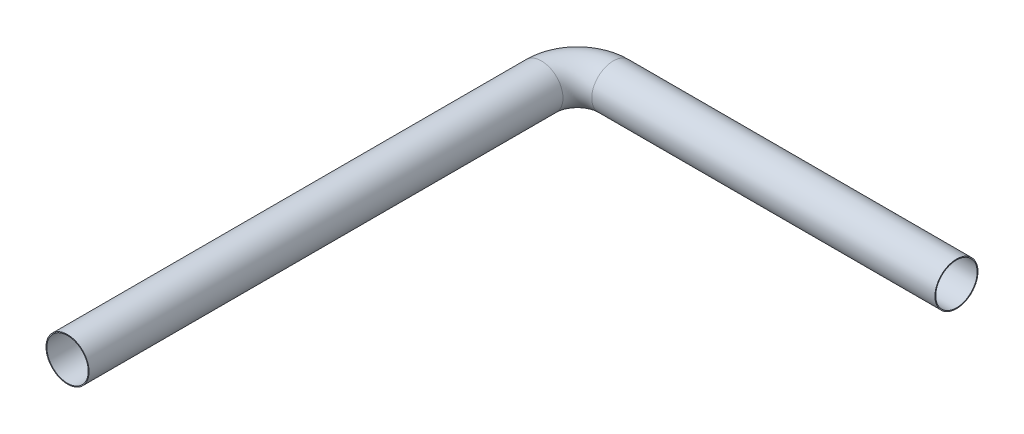
ISO-10303-21;
HEADER;
FILE_DESCRIPTION(('STEP AP214'),'2;1');
FILE_NAME('part.step','',(''),(''),'','','');
FILE_SCHEMA(('AUTOMOTIVE_DESIGN { 1 0 10303 214 1 1 1 1 }'));
ENDSEC;
DATA;
#1=APPLICATION_CONTEXT('core data for automotive mechanical design processes');
#2=APPLICATION_PROTOCOL_DEFINITION('international standard','automotive_design',2000,#1);
#3=PRODUCT_CONTEXT('',#1,'mechanical');
#4=PRODUCT('Part','Part','',(#3));
#5=PRODUCT_RELATED_PRODUCT_CATEGORY('part','',(#4));
#6=PRODUCT_DEFINITION_FORMATION('','',#4);
#7=PRODUCT_DEFINITION_CONTEXT('part definition',#1,'design');
#8=PRODUCT_DEFINITION('design','',#6,#7);
#9=PRODUCT_DEFINITION_SHAPE('','',#8);
#10=(LENGTH_UNIT() NAMED_UNIT(*) SI_UNIT(.MILLI.,.METRE.));
#11=(NAMED_UNIT(*) PLANE_ANGLE_UNIT() SI_UNIT($,.RADIAN.));
#12=(NAMED_UNIT(*) SI_UNIT($,.STERADIAN.) SOLID_ANGLE_UNIT());
#13=UNCERTAINTY_MEASURE_WITH_UNIT(LENGTH_MEASURE(1.E-05),#10,'distance_accuracy_value','');
#14=(GEOMETRIC_REPRESENTATION_CONTEXT(3) GLOBAL_UNCERTAINTY_ASSIGNED_CONTEXT((#13)) GLOBAL_UNIT_ASSIGNED_CONTEXT((#10,
#11,#12)) REPRESENTATION_CONTEXT('',''));
#15=CARTESIAN_POINT('',(0.,0.,0.));
#16=DIRECTION('',(0.,0.,1.));
#17=DIRECTION('',(1.,0.,0.));
#18=AXIS2_PLACEMENT_3D('',#15,#16,#17);
#19=CARTESIAN_POINT('',(0.,0.,0.));
#20=DIRECTION('',(0.,0.,-1.));
#21=DIRECTION('',(-1.,0.,0.));
#22=AXIS2_PLACEMENT_3D('',#19,#20,#21);
#23=CYLINDRICAL_SURFACE('',#22,30.);
#24=CARTESIAN_POINT('',(0.,0.,-660.));
#25=DIRECTION('',(0.,0.,1.));
#26=DIRECTION('',(1.,0.,0.));
#27=AXIS2_PLACEMENT_3D('',#24,#25,#26);
#28=CIRCLE('',#27,30.);
#29=CARTESIAN_POINT('',(-30.,0.,-660.));
#30=VERTEX_POINT('',#29);
#31=EDGE_CURVE('E99',#30,#30,#28,.T.);
#32=ORIENTED_EDGE('',*,*,#31,.T.);
#33=EDGE_LOOP('',(#32));
#34=FACE_BOUND('',#33,.T.);
#35=CARTESIAN_POINT('',(0.,0.,0.));
#36=DIRECTION('',(0.,0.,1.));
#37=DIRECTION('',(1.,0.,0.));
#38=AXIS2_PLACEMENT_3D('',#35,#36,#37);
#39=CIRCLE('',#38,30.);
#40=CARTESIAN_POINT('',(30.,0.,0.));
#41=VERTEX_POINT('',#40);
#42=EDGE_CURVE('E48',#41,#41,#39,.T.);
#43=ORIENTED_EDGE('',*,*,#42,.F.);
#44=EDGE_LOOP('',(#43));
#45=FACE_BOUND('',#44,.T.);
#46=ADVANCED_FACE('F33',(#34,#45),#23,.T.);
#47=CARTESIAN_POINT('',(50.,0.,-660.));
#48=DIRECTION('',(0.,-1.,0.));
#49=DIRECTION('',(0.,0.,-1.));
#50=AXIS2_PLACEMENT_3D('',#47,#48,#49);
#51=TOROIDAL_SURFACE('',#50,50.,30.);
#52=CARTESIAN_POINT('',(50.,0.,-710.));
#53=DIRECTION('',(-1.,0.,0.));
#54=DIRECTION('',(0.,0.,1.));
#55=AXIS2_PLACEMENT_3D('',#52,#53,#54);
#56=CIRCLE('',#55,30.);
#57=CARTESIAN_POINT('',(50.,0.,-740.));
#58=VERTEX_POINT('',#57);
#59=EDGE_CURVE('E37',#58,#58,#56,.T.);
#60=CARTESIAN_POINT('',(50.,0.,-660.));
#61=DIRECTION('',(0.,-1.,0.));
#62=DIRECTION('',(0.,0.,-1.));
#63=AXIS2_PLACEMENT_3D('',#60,#61,#62);
#64=CIRCLE('',#63,80.);
#65=EDGE_CURVE('',#30,#58,#64,.T.);
#66=ORIENTED_EDGE('',*,*,#31,.F.);
#67=ORIENTED_EDGE('',*,*,#59,.T.);
#68=ORIENTED_EDGE('',*,*,#65,.T.);
#69=ORIENTED_EDGE('',*,*,#65,.F.);
#70=EDGE_LOOP('',(#66,#68,#67,#69));
#71=FACE_BOUND('',#70,.T.);
#72=ADVANCED_FACE('F106',(#71),#51,.T.);
#73=CARTESIAN_POINT('',(50.,0.,-710.));
#74=DIRECTION('',(1.,0.,0.));
#75=DIRECTION('',(0.,0.,-1.));
#76=AXIS2_PLACEMENT_3D('',#73,#74,#75);
#77=CYLINDRICAL_SURFACE('',#76,30.);
#78=CARTESIAN_POINT('',(527.958415109164,0.,-710.));
#79=DIRECTION('',(-1.,0.,0.));
#80=DIRECTION('',(0.,0.,1.));
#81=AXIS2_PLACEMENT_3D('',#78,#79,#80);
#82=CIRCLE('',#81,30.);
#83=CARTESIAN_POINT('',(527.958415109164,0.,-680.));
#84=VERTEX_POINT('',#83);
#85=EDGE_CURVE('E53',#84,#84,#82,.T.);
#86=ORIENTED_EDGE('',*,*,#85,.T.);
#87=EDGE_LOOP('',(#86));
#88=FACE_BOUND('',#87,.T.);
#89=ORIENTED_EDGE('',*,*,#59,.F.);
#90=EDGE_LOOP('',(#89));
#91=FACE_BOUND('',#90,.T.);
#92=ADVANCED_FACE('F35',(#88,#91),#77,.T.);
#93=CARTESIAN_POINT('',(0.,0.,0.));
#94=DIRECTION('',(0.,0.,1.));
#95=DIRECTION('',(1.,0.,0.));
#96=AXIS2_PLACEMENT_3D('',#93,#94,#95);
#97=PLANE('',#96);
#98=CARTESIAN_POINT('',(0.,0.,0.));
#99=DIRECTION('',(0.,0.,1.));
#100=DIRECTION('',(1.,0.,0.));
#101=AXIS2_PLACEMENT_3D('',#98,#99,#100);
#102=CIRCLE('',#101,28.8);
#103=CARTESIAN_POINT('',(28.8,0.,0.));
#104=VERTEX_POINT('',#103);
#105=EDGE_CURVE('E92',#104,#104,#102,.F.);
#106=ORIENTED_EDGE('',*,*,#105,.T.);
#107=EDGE_LOOP('',(#106));
#108=FACE_BOUND('',#107,.T.);
#109=ORIENTED_EDGE('',*,*,#42,.T.);
#110=EDGE_LOOP('',(#109));
#111=FACE_BOUND('',#110,.T.);
#112=ADVANCED_FACE('F66',(#108,#111),#97,.T.);
#113=CARTESIAN_POINT('',(527.958415109164,0.,-710.));
#114=DIRECTION('',(-1.,0.,0.));
#115=DIRECTION('',(0.,0.,1.));
#116=AXIS2_PLACEMENT_3D('',#113,#114,#115);
#117=PLANE('',#116);
#118=CARTESIAN_POINT('',(527.958415109164,0.,-710.));
#119=DIRECTION('',(-1.,0.,0.));
#120=DIRECTION('',(0.,0.,1.));
#121=AXIS2_PLACEMENT_3D('',#118,#119,#120);
#122=CIRCLE('',#121,28.8);
#123=CARTESIAN_POINT('',(527.958415109164,0.,-681.2));
#124=VERTEX_POINT('',#123);
#125=EDGE_CURVE('E11',#124,#124,#122,.F.);
#126=ORIENTED_EDGE('',*,*,#125,.F.);
#127=EDGE_LOOP('',(#126));
#128=FACE_BOUND('',#127,.T.);
#129=ORIENTED_EDGE('',*,*,#85,.F.);
#130=EDGE_LOOP('',(#129));
#131=FACE_BOUND('',#130,.T.);
#132=ADVANCED_FACE('F63',(#128,#131),#117,.F.);
#133=CARTESIAN_POINT('',(0.,0.,0.));
#134=DIRECTION('',(0.,0.,-1.));
#135=DIRECTION('',(-1.,0.,0.));
#136=AXIS2_PLACEMENT_3D('',#133,#134,#135);
#137=CYLINDRICAL_SURFACE('',#136,28.8);
#138=CARTESIAN_POINT('',(0.,0.,-660.));
#139=DIRECTION('',(0.,0.,1.));
#140=DIRECTION('',(1.,0.,0.));
#141=AXIS2_PLACEMENT_3D('',#138,#139,#140);
#142=CIRCLE('',#141,28.8);
#143=CARTESIAN_POINT('',(-28.8,0.,-660.));
#144=VERTEX_POINT('',#143);
#145=EDGE_CURVE('E91',#144,#144,#142,.F.);
#146=ORIENTED_EDGE('',*,*,#145,.T.);
#147=EDGE_LOOP('',(#146));
#148=FACE_BOUND('',#147,.T.);
#149=ORIENTED_EDGE('',*,*,#105,.F.);
#150=EDGE_LOOP('',(#149));
#151=FACE_BOUND('',#150,.T.);
#152=ADVANCED_FACE('F65',(#148,#151),#137,.F.);
#153=CARTESIAN_POINT('',(50.,0.,-660.));
#154=DIRECTION('',(0.,-1.,0.));
#155=DIRECTION('',(0.,0.,-1.));
#156=AXIS2_PLACEMENT_3D('',#153,#154,#155);
#157=TOROIDAL_SURFACE('',#156,50.,28.8);
#158=CARTESIAN_POINT('',(50.,0.,-710.));
#159=DIRECTION('',(-1.,0.,0.));
#160=DIRECTION('',(0.,0.,1.));
#161=AXIS2_PLACEMENT_3D('',#158,#159,#160);
#162=CIRCLE('',#161,28.8);
#163=CARTESIAN_POINT('',(50.,0.,-738.8));
#164=VERTEX_POINT('',#163);
#165=EDGE_CURVE('E42',#164,#164,#162,.F.);
#166=CARTESIAN_POINT('',(50.,0.,-660.));
#167=DIRECTION('',(0.,-1.,0.));
#168=DIRECTION('',(0.,0.,-1.));
#169=AXIS2_PLACEMENT_3D('',#166,#167,#168);
#170=CIRCLE('',#169,78.8);
#171=EDGE_CURVE('',#144,#164,#170,.T.);
#172=ORIENTED_EDGE('',*,*,#145,.F.);
#173=ORIENTED_EDGE('',*,*,#165,.T.);
#174=ORIENTED_EDGE('',*,*,#171,.T.);
#175=ORIENTED_EDGE('',*,*,#171,.F.);
#176=EDGE_LOOP('',(#172,#174,#173,#175));
#177=FACE_BOUND('',#176,.T.);
#178=ADVANCED_FACE('F72',(#177),#157,.F.);
#179=CARTESIAN_POINT('',(50.,0.,-710.));
#180=DIRECTION('',(1.,0.,0.));
#181=DIRECTION('',(0.,0.,-1.));
#182=AXIS2_PLACEMENT_3D('',#179,#180,#181);
#183=CYLINDRICAL_SURFACE('',#182,28.8);
#184=ORIENTED_EDGE('',*,*,#125,.T.);
#185=EDGE_LOOP('',(#184));
#186=FACE_BOUND('',#185,.T.);
#187=ORIENTED_EDGE('',*,*,#165,.F.);
#188=EDGE_LOOP('',(#187));
#189=FACE_BOUND('',#188,.T.);
#190=ADVANCED_FACE('F60',(#186,#189),#183,.F.);
#191=CLOSED_SHELL('',(#46,#72,#92,#112,#132,#152,#178,#190));
#192=MANIFOLD_SOLID_BREP('B2',#191);
#193=ADVANCED_BREP_SHAPE_REPRESENTATION('',(#18,#192),#14);
#194=SHAPE_DEFINITION_REPRESENTATION(#9,#193);
ENDSEC;
END-ISO-10303-21;
